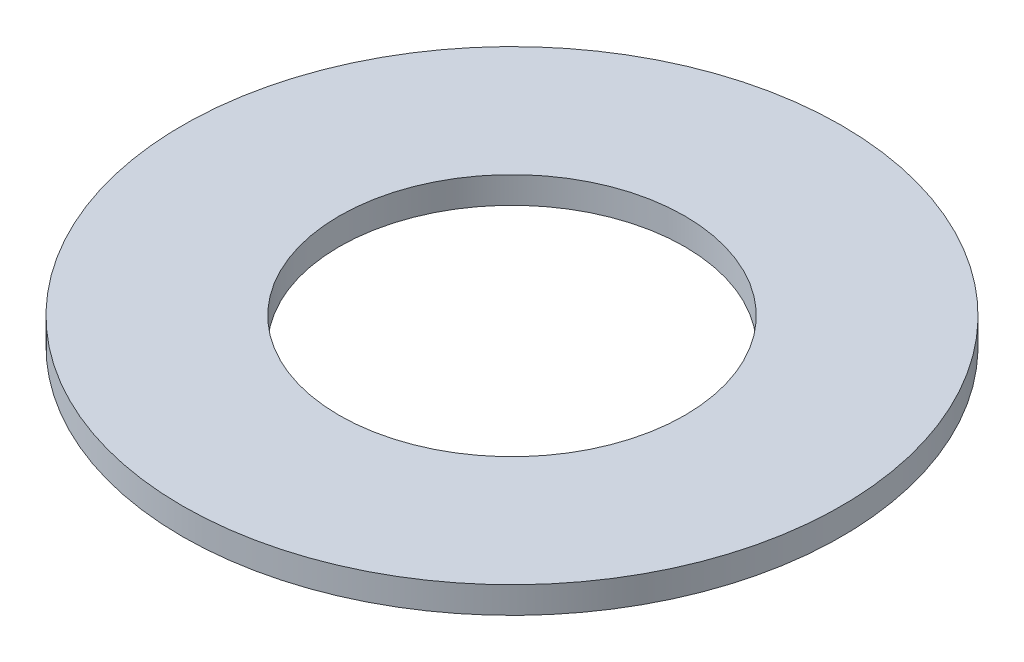
ISO-10303-21;
HEADER;
FILE_DESCRIPTION(('STEP AP214'),'2;1');
FILE_NAME('part.step','',(''),(''),'','','');
FILE_SCHEMA(('AUTOMOTIVE_DESIGN { 1 0 10303 214 1 1 1 1 }'));
ENDSEC;
DATA;
#1=APPLICATION_CONTEXT('core data for automotive mechanical design processes');
#2=APPLICATION_PROTOCOL_DEFINITION('international standard','automotive_design',2000,#1);
#3=PRODUCT_CONTEXT('',#1,'mechanical');
#4=PRODUCT('Part','Part','',(#3));
#5=PRODUCT_RELATED_PRODUCT_CATEGORY('part','',(#4));
#6=PRODUCT_DEFINITION_FORMATION('','',#4);
#7=PRODUCT_DEFINITION_CONTEXT('part definition',#1,'design');
#8=PRODUCT_DEFINITION('design','',#6,#7);
#9=PRODUCT_DEFINITION_SHAPE('','',#8);
#10=(LENGTH_UNIT() NAMED_UNIT(*) SI_UNIT(.MILLI.,.METRE.));
#11=(NAMED_UNIT(*) PLANE_ANGLE_UNIT() SI_UNIT($,.RADIAN.));
#12=(NAMED_UNIT(*) SI_UNIT($,.STERADIAN.) SOLID_ANGLE_UNIT());
#13=UNCERTAINTY_MEASURE_WITH_UNIT(LENGTH_MEASURE(1.E-05),#10,'distance_accuracy_value','');
#14=(GEOMETRIC_REPRESENTATION_CONTEXT(3) GLOBAL_UNCERTAINTY_ASSIGNED_CONTEXT((#13)) GLOBAL_UNIT_ASSIGNED_CONTEXT((#10,
#11,#12)) REPRESENTATION_CONTEXT('',''));
#15=CARTESIAN_POINT('',(0.,0.,0.));
#16=DIRECTION('',(0.,0.,1.));
#17=DIRECTION('',(1.,0.,0.));
#18=AXIS2_PLACEMENT_3D('',#15,#16,#17);
#19=CARTESIAN_POINT('',(0.,5.,0.));
#20=DIRECTION('',(0.,-1.,0.));
#21=DIRECTION('',(0.,0.,-1.));
#22=AXIS2_PLACEMENT_3D('',#19,#20,#21);
#23=CYLINDRICAL_SURFACE('',#22,62.);
#24=CARTESIAN_POINT('',(0.,5.,0.));
#25=DIRECTION('',(0.,1.,0.));
#26=DIRECTION('',(0.,0.,1.));
#27=AXIS2_PLACEMENT_3D('',#24,#25,#26);
#28=CIRCLE('',#27,62.);
#29=CARTESIAN_POINT('',(0.,5.,62.));
#30=VERTEX_POINT('',#29);
#31=EDGE_CURVE('E10',#30,#30,#28,.T.);
#32=ORIENTED_EDGE('',*,*,#31,.F.);
#33=EDGE_LOOP('',(#32));
#34=FACE_BOUND('',#33,.T.);
#35=CARTESIAN_POINT('',(0.,0.,0.));
#36=DIRECTION('',(0.,1.,0.));
#37=DIRECTION('',(0.,0.,1.));
#38=AXIS2_PLACEMENT_3D('',#35,#36,#37);
#39=CIRCLE('',#38,62.);
#40=CARTESIAN_POINT('',(0.,0.,62.));
#41=VERTEX_POINT('',#40);
#42=EDGE_CURVE('E38',#41,#41,#39,.T.);
#43=ORIENTED_EDGE('',*,*,#42,.T.);
#44=EDGE_LOOP('',(#43));
#45=FACE_BOUND('',#44,.T.);
#46=ADVANCED_FACE('F35',(#34,#45),#23,.T.);
#47=CARTESIAN_POINT('',(0.,5.,0.));
#48=DIRECTION('',(0.,1.,0.));
#49=DIRECTION('',(0.,0.,1.));
#50=AXIS2_PLACEMENT_3D('',#47,#48,#49);
#51=PLANE('',#50);
#52=CARTESIAN_POINT('',(0.,5.,0.));
#53=DIRECTION('',(0.,1.,0.));
#54=DIRECTION('',(0.,0.,1.));
#55=AXIS2_PLACEMENT_3D('',#52,#53,#54);
#56=CIRCLE('',#55,32.5);
#57=CARTESIAN_POINT('',(0.,5.,32.5));
#58=VERTEX_POINT('',#57);
#59=EDGE_CURVE('E45',#58,#58,#56,.T.);
#60=ORIENTED_EDGE('',*,*,#59,.F.);
#61=EDGE_LOOP('',(#60));
#62=FACE_BOUND('',#61,.T.);
#63=ORIENTED_EDGE('',*,*,#31,.T.);
#64=EDGE_LOOP('',(#63));
#65=FACE_BOUND('',#64,.T.);
#66=ADVANCED_FACE('F58',(#62,#65),#51,.T.);
#67=CARTESIAN_POINT('',(0.,0.,0.));
#68=DIRECTION('',(0.,1.,0.));
#69=DIRECTION('',(0.,0.,1.));
#70=AXIS2_PLACEMENT_3D('',#67,#68,#69);
#71=PLANE('',#70);
#72=CARTESIAN_POINT('',(0.,0.,0.));
#73=DIRECTION('',(0.,-1.,0.));
#74=DIRECTION('',(0.,0.,-1.));
#75=AXIS2_PLACEMENT_3D('',#72,#73,#74);
#76=CIRCLE('',#75,32.5);
#77=CARTESIAN_POINT('',(0.,0.,-32.5));
#78=VERTEX_POINT('',#77);
#79=EDGE_CURVE('E49',#78,#78,#76,.T.);
#80=ORIENTED_EDGE('',*,*,#79,.F.);
#81=EDGE_LOOP('',(#80));
#82=FACE_BOUND('',#81,.T.);
#83=ORIENTED_EDGE('',*,*,#42,.F.);
#84=EDGE_LOOP('',(#83));
#85=FACE_BOUND('',#84,.T.);
#86=ADVANCED_FACE('F55',(#82,#85),#71,.F.);
#87=CARTESIAN_POINT('',(0.,10.,0.));
#88=DIRECTION('',(0.,-1.,0.));
#89=DIRECTION('',(0.,0.,-1.));
#90=AXIS2_PLACEMENT_3D('',#87,#88,#89);
#91=CYLINDRICAL_SURFACE('',#90,32.5);
#92=ORIENTED_EDGE('',*,*,#59,.T.);
#93=EDGE_LOOP('',(#92));
#94=FACE_BOUND('',#93,.T.);
#95=ORIENTED_EDGE('',*,*,#79,.T.);
#96=EDGE_LOOP('',(#95));
#97=FACE_BOUND('',#96,.T.);
#98=ADVANCED_FACE('F53',(#94,#97),#91,.F.);
#99=CLOSED_SHELL('',(#46,#66,#86,#98));
#100=MANIFOLD_SOLID_BREP('B2',#99);
#101=ADVANCED_BREP_SHAPE_REPRESENTATION('',(#18,#100),#14);
#102=SHAPE_DEFINITION_REPRESENTATION(#9,#101);
ENDSEC;
END-ISO-10303-21;
